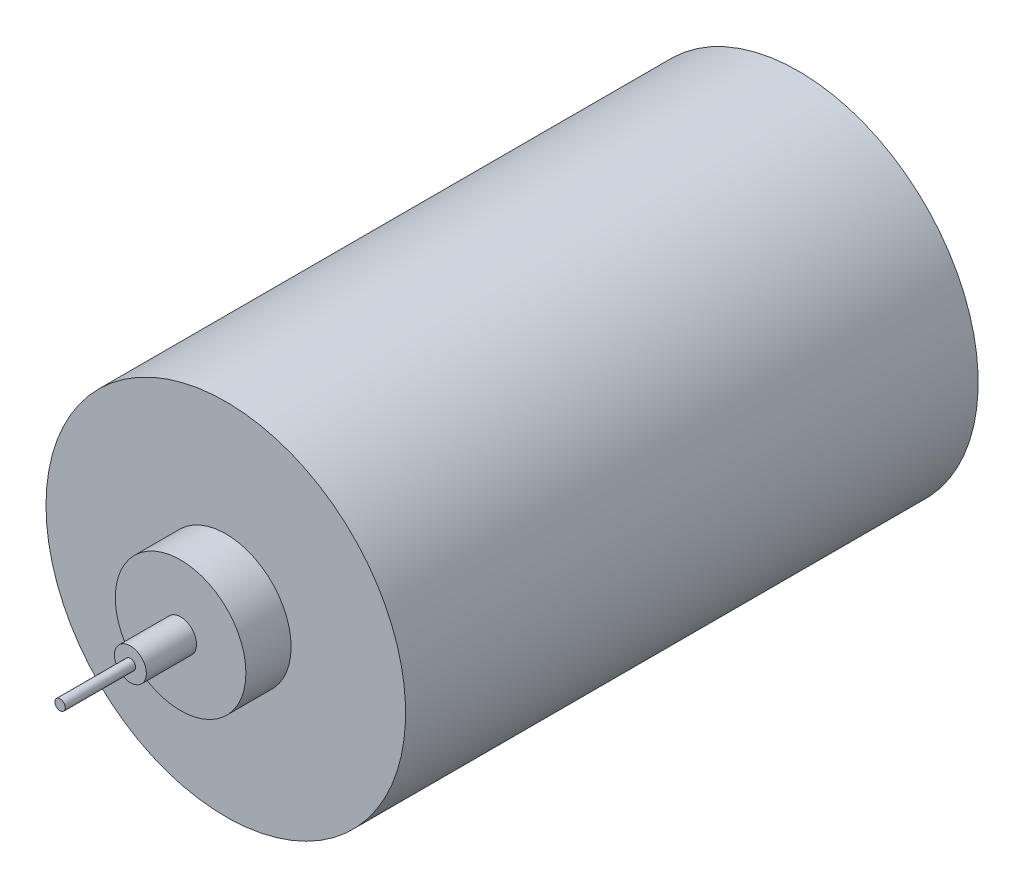
ISO-10303-21;
HEADER;
FILE_DESCRIPTION(('STEP AP214'),'2;1');
FILE_NAME('part.step','',(''),(''),'','','');
FILE_SCHEMA(('AUTOMOTIVE_DESIGN { 1 0 10303 214 1 1 1 1 }'));
ENDSEC;
DATA;
#1=APPLICATION_CONTEXT('core data for automotive mechanical design processes');
#2=APPLICATION_PROTOCOL_DEFINITION('international standard','automotive_design',2000,#1);
#3=PRODUCT_CONTEXT('',#1,'mechanical');
#4=PRODUCT('Part','Part','',(#3));
#5=PRODUCT_RELATED_PRODUCT_CATEGORY('part','',(#4));
#6=PRODUCT_DEFINITION_FORMATION('','',#4);
#7=PRODUCT_DEFINITION_CONTEXT('part definition',#1,'design');
#8=PRODUCT_DEFINITION('design','',#6,#7);
#9=PRODUCT_DEFINITION_SHAPE('','',#8);
#10=(LENGTH_UNIT() NAMED_UNIT(*) SI_UNIT(.MILLI.,.METRE.));
#11=(NAMED_UNIT(*) PLANE_ANGLE_UNIT() SI_UNIT($,.RADIAN.));
#12=(NAMED_UNIT(*) SI_UNIT($,.STERADIAN.) SOLID_ANGLE_UNIT());
#13=UNCERTAINTY_MEASURE_WITH_UNIT(LENGTH_MEASURE(1.E-05),#10,'distance_accuracy_value','');
#14=(GEOMETRIC_REPRESENTATION_CONTEXT(3) GLOBAL_UNCERTAINTY_ASSIGNED_CONTEXT((#13)) GLOBAL_UNIT_ASSIGNED_CONTEXT((#10,
#11,#12)) REPRESENTATION_CONTEXT('',''));
#15=CARTESIAN_POINT('',(0.,0.,0.));
#16=DIRECTION('',(0.,0.,1.));
#17=DIRECTION('',(1.,0.,0.));
#18=AXIS2_PLACEMENT_3D('',#15,#16,#17);
#19=CARTESIAN_POINT('',(0.,0.,73.5));
#20=DIRECTION('',(0.,0.,-1.));
#21=DIRECTION('',(-1.,0.,0.));
#22=AXIS2_PLACEMENT_3D('',#19,#20,#21);
#23=CYLINDRICAL_SURFACE('',#22,1.5875);
#24=CARTESIAN_POINT('',(0.,0.,61.5));
#25=DIRECTION('',(0.,0.,1.));
#26=DIRECTION('',(1.,0.,0.));
#27=AXIS2_PLACEMENT_3D('',#24,#25,#26);
#28=CIRCLE('',#27,1.5875);
#29=CARTESIAN_POINT('',(1.5875,0.,61.5));
#30=VERTEX_POINT('',#29);
#31=EDGE_CURVE('E10',#30,#30,#28,.T.);
#32=ORIENTED_EDGE('',*,*,#31,.T.);
#33=EDGE_LOOP('',(#32));
#34=FACE_BOUND('',#33,.T.);
#35=CARTESIAN_POINT('',(0.,0.,66.5));
#36=DIRECTION('',(0.,0.,1.));
#37=DIRECTION('',(1.,0.,0.));
#38=AXIS2_PLACEMENT_3D('',#35,#36,#37);
#39=CIRCLE('',#38,1.5875);
#40=CARTESIAN_POINT('',(1.5875,0.,66.5));
#41=VERTEX_POINT('',#40);
#42=EDGE_CURVE('E56',#41,#41,#39,.T.);
#43=ORIENTED_EDGE('',*,*,#42,.F.);
#44=EDGE_LOOP('',(#43));
#45=FACE_BOUND('',#44,.T.);
#46=ADVANCED_FACE('F37',(#34,#45),#23,.T.);
#47=CARTESIAN_POINT('',(0.,0.,57.));
#48=DIRECTION('',(0.,0.,-1.));
#49=DIRECTION('',(-1.,0.,0.));
#50=AXIS2_PLACEMENT_3D('',#47,#48,#49);
#51=CYLINDRICAL_SURFACE('',#50,17.9);
#52=CARTESIAN_POINT('',(0.,0.,57.));
#53=DIRECTION('',(0.,0.,1.));
#54=DIRECTION('',(1.,0.,0.));
#55=AXIS2_PLACEMENT_3D('',#52,#53,#54);
#56=CIRCLE('',#55,17.9);
#57=CARTESIAN_POINT('',(-17.9,0.,57.));
#58=VERTEX_POINT('',#57);
#59=EDGE_CURVE('E52',#58,#58,#56,.T.);
#60=CARTESIAN_POINT('',(0.,0.,0.));
#61=DIRECTION('',(0.,0.,1.));
#62=DIRECTION('',(1.,0.,0.));
#63=AXIS2_PLACEMENT_3D('',#60,#61,#62);
#64=CIRCLE('',#63,17.9);
#65=CARTESIAN_POINT('',(-17.9,0.,0.));
#66=VERTEX_POINT('',#65);
#67=EDGE_CURVE('E41',#66,#66,#64,.T.);
#68=CARTESIAN_POINT('',(-17.9,0.,57.));
#69=CARTESIAN_POINT('',(-17.9,0.,56.40625));
#70=CARTESIAN_POINT('',(-17.9,0.,55.8125));
#71=CARTESIAN_POINT('',(-17.9,0.,54.625));
#72=CARTESIAN_POINT('',(-17.9,0.,54.03125));
#73=CARTESIAN_POINT('',(-17.9,0.,52.84375));
#74=CARTESIAN_POINT('',(-17.9,0.,52.25));
#75=CARTESIAN_POINT('',(-17.9,0.,51.0625));
#76=CARTESIAN_POINT('',(-17.9,0.,50.46875));
#77=CARTESIAN_POINT('',(-17.9,0.,49.28125));
#78=CARTESIAN_POINT('',(-17.9,0.,48.6875));
#79=CARTESIAN_POINT('',(-17.9,0.,47.5));
#80=CARTESIAN_POINT('',(-17.9,0.,46.90625));
#81=CARTESIAN_POINT('',(-17.9,0.,45.71875));
#82=CARTESIAN_POINT('',(-17.9,0.,45.125));
#83=CARTESIAN_POINT('',(-17.9,0.,43.9375));
#84=CARTESIAN_POINT('',(-17.9,0.,43.34375));
#85=CARTESIAN_POINT('',(-17.9,0.,42.15625));
#86=CARTESIAN_POINT('',(-17.9,0.,41.5625));
#87=CARTESIAN_POINT('',(-17.9,0.,40.375));
#88=CARTESIAN_POINT('',(-17.9,0.,39.78125));
#89=CARTESIAN_POINT('',(-17.9,0.,38.59375));
#90=CARTESIAN_POINT('',(-17.9,0.,38.));
#91=CARTESIAN_POINT('',(-17.9,0.,36.8125));
#92=CARTESIAN_POINT('',(-17.9,0.,36.21875));
#93=CARTESIAN_POINT('',(-17.9,0.,35.03125));
#94=CARTESIAN_POINT('',(-17.9,0.,34.4375));
#95=CARTESIAN_POINT('',(-17.9,0.,33.25));
#96=CARTESIAN_POINT('',(-17.9,0.,32.65625));
#97=CARTESIAN_POINT('',(-17.9,0.,31.46875));
#98=CARTESIAN_POINT('',(-17.9,0.,30.875));
#99=CARTESIAN_POINT('',(-17.9,0.,29.6875));
#100=CARTESIAN_POINT('',(-17.9,0.,29.09375));
#101=CARTESIAN_POINT('',(-17.9,0.,27.90625));
#102=CARTESIAN_POINT('',(-17.9,0.,27.3125));
#103=CARTESIAN_POINT('',(-17.9,0.,26.125));
#104=CARTESIAN_POINT('',(-17.9,0.,25.53125));
#105=CARTESIAN_POINT('',(-17.9,0.,24.34375));
#106=CARTESIAN_POINT('',(-17.9,0.,23.75));
#107=CARTESIAN_POINT('',(-17.9,0.,22.5625));
#108=CARTESIAN_POINT('',(-17.9,0.,21.96875));
#109=CARTESIAN_POINT('',(-17.9,0.,20.78125));
#110=CARTESIAN_POINT('',(-17.9,0.,20.1875));
#111=CARTESIAN_POINT('',(-17.9,0.,19.));
#112=CARTESIAN_POINT('',(-17.9,0.,18.40625));
#113=CARTESIAN_POINT('',(-17.9,0.,17.21875));
#114=CARTESIAN_POINT('',(-17.9,0.,16.625));
#115=CARTESIAN_POINT('',(-17.9,0.,15.4375));
#116=CARTESIAN_POINT('',(-17.9,0.,14.84375));
#117=CARTESIAN_POINT('',(-17.9,0.,13.65625));
#118=CARTESIAN_POINT('',(-17.9,0.,13.0625));
#119=CARTESIAN_POINT('',(-17.9,0.,11.875));
#120=CARTESIAN_POINT('',(-17.9,0.,11.28125));
#121=CARTESIAN_POINT('',(-17.9,0.,10.09375));
#122=CARTESIAN_POINT('',(-17.9,0.,9.5));
#123=CARTESIAN_POINT('',(-17.9,0.,8.3125));
#124=CARTESIAN_POINT('',(-17.9,0.,7.71875));
#125=CARTESIAN_POINT('',(-17.9,0.,6.53125));
#126=CARTESIAN_POINT('',(-17.9,0.,5.9375));
#127=CARTESIAN_POINT('',(-17.9,0.,4.75));
#128=CARTESIAN_POINT('',(-17.9,0.,4.15625));
#129=CARTESIAN_POINT('',(-17.9,0.,2.96875));
#130=CARTESIAN_POINT('',(-17.9,0.,2.375));
#131=CARTESIAN_POINT('',(-17.9,0.,1.1875));
#132=CARTESIAN_POINT('',(-17.9,0.,0.593749999999999));
#133=CARTESIAN_POINT('',(-17.9,0.,0.));
#134=B_SPLINE_CURVE_WITH_KNOTS('',3,(#68,#69,#70,#71,#72,#73,#74,#75,#76,#77,#78,#79,#80,#81,
#82,#83,#84,#85,#86,#87,#88,#89,#90,#91,#92,#93,#94,#95,#96,#97,#98,#99,#100,#101,#102,#103,
#104,#105,#106,#107,#108,#109,#110,#111,#112,#113,#114,#115,#116,#117,#118,#119,#120,#121,#122,
#123,#124,#125,#126,#127,#128,#129,#130,#131,#132,#133),.UNSPECIFIED.,.F.,.F.,(4,2,2,2,2,2,2,2,
2,2,2,2,2,2,2,2,2,2,2,2,2,2,2,2,2,2,2,2,2,2,2,2,4),(0.,1.78125000000001,3.5625,5.34375,
7.12500000000001,8.90625,10.6875,12.46875,14.25,16.03125,17.8125,19.59375,21.375,23.15625,
24.9375,26.71875,28.5,30.28125,32.0625,33.84375,35.625,37.40625,39.1875,40.96875,42.75,44.53125,
46.3125,48.09375,49.875,51.65625,53.4375,55.21875,57.),.UNSPECIFIED.);
#135=EDGE_CURVE('BSEAM39',#58,#66,#134,.T.);
#136=ORIENTED_EDGE('',*,*,#59,.F.);
#137=ORIENTED_EDGE('',*,*,#67,.T.);
#138=ORIENTED_EDGE('',*,*,#135,.T.);
#139=ORIENTED_EDGE('',*,*,#135,.F.);
#140=EDGE_LOOP('',(#136,#138,#137,#139));
#141=FACE_BOUND('',#140,.T.);
#142=ADVANCED_FACE('F39',(#141),#51,.T.);
#143=CARTESIAN_POINT('',(0.,0.,57.));
#144=DIRECTION('',(0.,0.,1.));
#145=DIRECTION('',(1.,0.,0.));
#146=AXIS2_PLACEMENT_3D('',#143,#144,#145);
#147=PLANE('',#146);
#148=CARTESIAN_POINT('',(0.,0.,57.));
#149=DIRECTION('',(0.,0.,1.));
#150=DIRECTION('',(1.,0.,0.));
#151=AXIS2_PLACEMENT_3D('',#148,#149,#150);
#152=CIRCLE('',#151,6.5);
#153=CARTESIAN_POINT('',(6.5,0.,57.));
#154=VERTEX_POINT('',#153);
#155=EDGE_CURVE('E46',#154,#154,#152,.T.);
#156=ORIENTED_EDGE('',*,*,#155,.F.);
#157=EDGE_LOOP('',(#156));
#158=FACE_BOUND('',#157,.T.);
#159=ORIENTED_EDGE('',*,*,#59,.T.);
#160=EDGE_LOOP('',(#159));
#161=FACE_BOUND('',#160,.T.);
#162=ADVANCED_FACE('F73',(#158,#161),#147,.T.);
#163=CARTESIAN_POINT('',(0.,0.,0.));
#164=DIRECTION('',(0.,0.,1.));
#165=DIRECTION('',(1.,0.,0.));
#166=AXIS2_PLACEMENT_3D('',#163,#164,#165);
#167=PLANE('',#166);
#168=ORIENTED_EDGE('',*,*,#67,.F.);
#169=EDGE_LOOP('',(#168));
#170=FACE_BOUND('',#169,.T.);
#171=ADVANCED_FACE('F70',(#170),#167,.F.);
#172=CARTESIAN_POINT('',(0.,0.,61.5));
#173=DIRECTION('',(0.,0.,-1.));
#174=DIRECTION('',(-1.,0.,0.));
#175=AXIS2_PLACEMENT_3D('',#172,#173,#174);
#176=CYLINDRICAL_SURFACE('',#175,6.5);
#177=CARTESIAN_POINT('',(0.,0.,61.5));
#178=DIRECTION('',(0.,0.,1.));
#179=DIRECTION('',(1.,0.,0.));
#180=AXIS2_PLACEMENT_3D('',#177,#178,#179);
#181=CIRCLE('',#180,6.5);
#182=CARTESIAN_POINT('',(6.5,0.,61.5));
#183=VERTEX_POINT('',#182);
#184=EDGE_CURVE('E58',#183,#183,#181,.T.);
#185=ORIENTED_EDGE('',*,*,#184,.F.);
#186=EDGE_LOOP('',(#185));
#187=FACE_BOUND('',#186,.T.);
#188=ORIENTED_EDGE('',*,*,#155,.T.);
#189=EDGE_LOOP('',(#188));
#190=FACE_BOUND('',#189,.T.);
#191=ADVANCED_FACE('F72',(#187,#190),#176,.T.);
#192=CARTESIAN_POINT('',(0.,0.,61.5));
#193=DIRECTION('',(0.,0.,1.));
#194=DIRECTION('',(1.,0.,0.));
#195=AXIS2_PLACEMENT_3D('',#192,#193,#194);
#196=PLANE('',#195);
#197=ORIENTED_EDGE('',*,*,#31,.F.);
#198=EDGE_LOOP('',(#197));
#199=FACE_BOUND('',#198,.T.);
#200=ORIENTED_EDGE('',*,*,#184,.T.);
#201=EDGE_LOOP('',(#200));
#202=FACE_BOUND('',#201,.T.);
#203=ADVANCED_FACE('F78',(#199,#202),#196,.T.);
#204=CARTESIAN_POINT('',(0.,0.,66.5));
#205=DIRECTION('',(0.,0.,1.));
#206=DIRECTION('',(1.,0.,0.));
#207=AXIS2_PLACEMENT_3D('',#204,#205,#206);
#208=PLANE('',#207);
#209=CARTESIAN_POINT('',(0.,0.,66.5));
#210=DIRECTION('',(0.,0.,1.));
#211=DIRECTION('',(1.,0.,0.));
#212=AXIS2_PLACEMENT_3D('',#209,#210,#211);
#213=CIRCLE('',#212,0.518930274867552);
#214=CARTESIAN_POINT('',(0.518930274867552,0.,66.5));
#215=VERTEX_POINT('',#214);
#216=EDGE_CURVE('E114',#215,#215,#213,.T.);
#217=ORIENTED_EDGE('',*,*,#216,.F.);
#218=EDGE_LOOP('',(#217));
#219=FACE_BOUND('',#218,.T.);
#220=ORIENTED_EDGE('',*,*,#42,.T.);
#221=EDGE_LOOP('',(#220));
#222=FACE_BOUND('',#221,.T.);
#223=ADVANCED_FACE('F95',(#219,#222),#208,.T.);
#224=CARTESIAN_POINT('',(0.,0.,66.5));
#225=DIRECTION('',(0.,0.,1.));
#226=DIRECTION('',(1.,0.,0.));
#227=AXIS2_PLACEMENT_3D('',#224,#225,#226);
#228=CYLINDRICAL_SURFACE('',#227,0.518930274867552);
#229=ORIENTED_EDGE('',*,*,#216,.T.);
#230=EDGE_LOOP('',(#229));
#231=FACE_BOUND('',#230,.T.);
#232=CARTESIAN_POINT('',(0.,0.,73.5));
#233=DIRECTION('',(0.,0.,1.));
#234=DIRECTION('',(1.,0.,0.));
#235=AXIS2_PLACEMENT_3D('',#232,#233,#234);
#236=CIRCLE('',#235,0.518930274867552);
#237=CARTESIAN_POINT('',(0.518930274867552,0.,73.5));
#238=VERTEX_POINT('',#237);
#239=EDGE_CURVE('E119',#238,#238,#236,.T.);
#240=ORIENTED_EDGE('',*,*,#239,.F.);
#241=EDGE_LOOP('',(#240));
#242=FACE_BOUND('',#241,.T.);
#243=ADVANCED_FACE('F100',(#231,#242),#228,.T.);
#244=CARTESIAN_POINT('',(0.,0.,73.5));
#245=DIRECTION('',(0.,0.,1.));
#246=DIRECTION('',(1.,0.,0.));
#247=AXIS2_PLACEMENT_3D('',#244,#245,#246);
#248=PLANE('',#247);
#249=ORIENTED_EDGE('',*,*,#239,.T.);
#250=EDGE_LOOP('',(#249));
#251=FACE_BOUND('',#250,.T.);
#252=ADVANCED_FACE('F92',(#251),#248,.T.);
#253=CLOSED_SHELL('',(#46,#142,#162,#171,#191,#203,#223,#243,#252));
#254=MANIFOLD_SOLID_BREP('B2',#253);
#255=ADVANCED_BREP_SHAPE_REPRESENTATION('',(#18,#254),#14);
#256=SHAPE_DEFINITION_REPRESENTATION(#9,#255);
ENDSEC;
END-ISO-10303-21;
